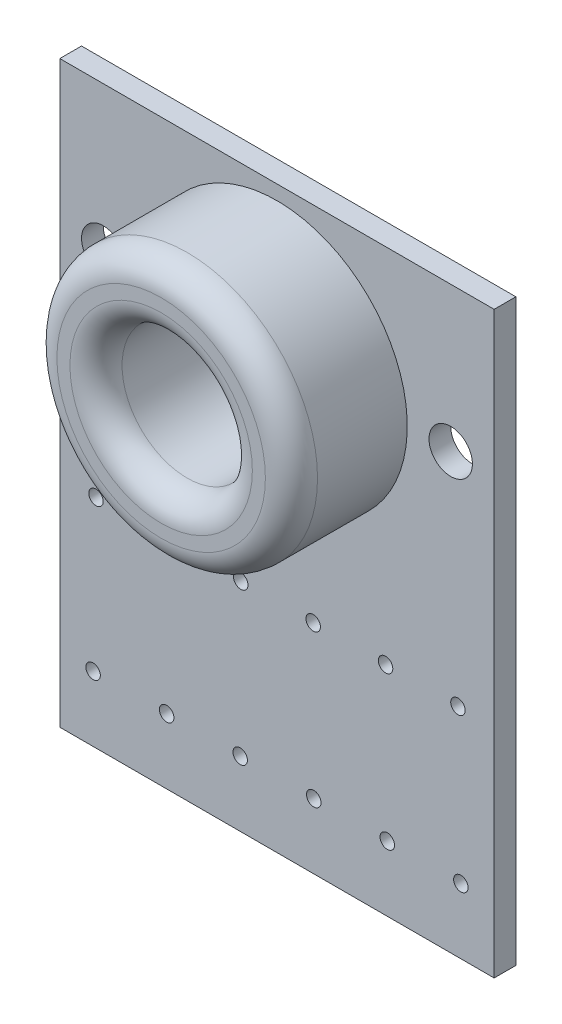
ISO-10303-21;
HEADER;
FILE_DESCRIPTION(('STEP AP214'),'2;1');
FILE_NAME('part.step','',(''),(''),'','','');
FILE_SCHEMA(('AUTOMOTIVE_DESIGN { 1 0 10303 214 1 1 1 1 }'));
ENDSEC;
DATA;
#1=APPLICATION_CONTEXT('core data for automotive mechanical design processes');
#2=APPLICATION_PROTOCOL_DEFINITION('international standard','automotive_design',2000,#1);
#3=PRODUCT_CONTEXT('',#1,'mechanical');
#4=PRODUCT('Part','Part','',(#3));
#5=PRODUCT_RELATED_PRODUCT_CATEGORY('part','',(#4));
#6=PRODUCT_DEFINITION_FORMATION('','',#4);
#7=PRODUCT_DEFINITION_CONTEXT('part definition',#1,'design');
#8=PRODUCT_DEFINITION('design','',#6,#7);
#9=PRODUCT_DEFINITION_SHAPE('','',#8);
#10=(LENGTH_UNIT() NAMED_UNIT(*) SI_UNIT(.MILLI.,.METRE.));
#11=(NAMED_UNIT(*) PLANE_ANGLE_UNIT() SI_UNIT($,.RADIAN.));
#12=(NAMED_UNIT(*) SI_UNIT($,.STERADIAN.) SOLID_ANGLE_UNIT());
#13=UNCERTAINTY_MEASURE_WITH_UNIT(LENGTH_MEASURE(1.E-05),#10,'distance_accuracy_value','');
#14=(GEOMETRIC_REPRESENTATION_CONTEXT(3) GLOBAL_UNCERTAINTY_ASSIGNED_CONTEXT((#13)) GLOBAL_UNIT_ASSIGNED_CONTEXT((#10,
#11,#12)) REPRESENTATION_CONTEXT('',''));
#15=CARTESIAN_POINT('',(0.,0.,0.));
#16=DIRECTION('',(0.,0.,1.));
#17=DIRECTION('',(1.,0.,0.));
#18=AXIS2_PLACEMENT_3D('',#15,#16,#17);
#19=CARTESIAN_POINT('',(-15.,20.,1.5));
#20=DIRECTION('',(0.,0.,-1.));
#21=DIRECTION('',(-1.,0.,0.));
#22=AXIS2_PLACEMENT_3D('',#19,#20,#21);
#23=PLANE('',#22);
#24=CARTESIAN_POINT('',(-12.,10.,1.5));
#25=DIRECTION('',(0.,0.,1.));
#26=DIRECTION('',(1.,0.,0.));
#27=AXIS2_PLACEMENT_3D('',#24,#25,#26);
#28=CIRCLE('',#27,1.5);
#29=CARTESIAN_POINT('',(-10.5,10.,1.5));
#30=VERTEX_POINT('',#29);
#31=EDGE_CURVE('E146',#30,#30,#28,.T.);
#32=ORIENTED_EDGE('',*,*,#31,.F.);
#33=EDGE_LOOP('',(#32));
#34=FACE_BOUND('',#33,.T.);
#35=CARTESIAN_POINT('',(7.5,-5.,1.5));
#36=DIRECTION('',(0.,0.,1.));
#37=DIRECTION('',(1.,0.,0.));
#38=AXIS2_PLACEMENT_3D('',#35,#36,#37);
#39=CIRCLE('',#38,0.500000000000001);
#40=CARTESIAN_POINT('',(8.,-5.,1.5));
#41=VERTEX_POINT('',#40);
#42=EDGE_CURVE('E158',#41,#41,#39,.T.);
#43=ORIENTED_EDGE('',*,*,#42,.F.);
#44=EDGE_LOOP('',(#43));
#45=FACE_BOUND('',#44,.T.);
#46=CARTESIAN_POINT('',(-2.5,-5.,1.5));
#47=DIRECTION('',(0.,0.,1.));
#48=DIRECTION('',(1.,0.,0.));
#49=AXIS2_PLACEMENT_3D('',#46,#47,#48);
#50=CIRCLE('',#49,0.500000000000001);
#51=CARTESIAN_POINT('',(-2.,-5.,1.5));
#52=VERTEX_POINT('',#51);
#53=EDGE_CURVE('E170',#52,#52,#50,.T.);
#54=ORIENTED_EDGE('',*,*,#53,.F.);
#55=EDGE_LOOP('',(#54));
#56=FACE_BOUND('',#55,.T.);
#57=CARTESIAN_POINT('',(12.7,-15.5,1.5));
#58=DIRECTION('',(0.,0.,1.));
#59=DIRECTION('',(1.,0.,0.));
#60=AXIS2_PLACEMENT_3D('',#57,#58,#59);
#61=CIRCLE('',#60,0.500000000000001);
#62=CARTESIAN_POINT('',(13.2,-15.5,1.5));
#63=VERTEX_POINT('',#62);
#64=EDGE_CURVE('E182',#63,#63,#61,.T.);
#65=ORIENTED_EDGE('',*,*,#64,.F.);
#66=EDGE_LOOP('',(#65));
#67=FACE_BOUND('',#66,.T.);
#68=CARTESIAN_POINT('',(2.54,-15.5,1.5));
#69=DIRECTION('',(0.,0.,1.));
#70=DIRECTION('',(1.,0.,0.));
#71=AXIS2_PLACEMENT_3D('',#68,#69,#70);
#72=CIRCLE('',#71,0.500000000000001);
#73=CARTESIAN_POINT('',(3.04,-15.5,1.5));
#74=VERTEX_POINT('',#73);
#75=EDGE_CURVE('E194',#74,#74,#72,.T.);
#76=ORIENTED_EDGE('',*,*,#75,.F.);
#77=EDGE_LOOP('',(#76));
#78=FACE_BOUND('',#77,.T.);
#79=CARTESIAN_POINT('',(-7.62,-15.5,1.5));
#80=DIRECTION('',(0.,0.,1.));
#81=DIRECTION('',(1.,0.,0.));
#82=AXIS2_PLACEMENT_3D('',#79,#80,#81);
#83=CIRCLE('',#82,0.500000000000001);
#84=CARTESIAN_POINT('',(-7.12,-15.5,1.5));
#85=VERTEX_POINT('',#84);
#86=EDGE_CURVE('E206',#85,#85,#83,.T.);
#87=ORIENTED_EDGE('',*,*,#86,.F.);
#88=EDGE_LOOP('',(#87));
#89=FACE_BOUND('',#88,.T.);
#90=CARTESIAN_POINT('',(-12.5,-5.,1.5));
#91=DIRECTION('',(0.,0.,1.));
#92=DIRECTION('',(1.,0.,0.));
#93=AXIS2_PLACEMENT_3D('',#90,#91,#92);
#94=CIRCLE('',#93,0.500000000000001);
#95=CARTESIAN_POINT('',(-12.,-5.,1.5));
#96=VERTEX_POINT('',#95);
#97=EDGE_CURVE('E218',#96,#96,#94,.T.);
#98=ORIENTED_EDGE('',*,*,#97,.F.);
#99=EDGE_LOOP('',(#98));
#100=FACE_BOUND('',#99,.T.);
#101=DIRECTION('',(0.,-1.,0.));
#102=VECTOR('',#101,1.);
#103=CARTESIAN_POINT('',(-15.,-20.,1.5));
#104=LINE('',#103,#102);
#105=CARTESIAN_POINT('',(-15.,20.,1.5));
#106=VERTEX_POINT('',#105);
#107=CARTESIAN_POINT('',(-15.,-20.,1.5));
#108=VERTEX_POINT('',#107);
#109=EDGE_CURVE('E84',#106,#108,#104,.T.);
#110=ORIENTED_EDGE('',*,*,#109,.T.);
#111=DIRECTION('',(1.,0.,0.));
#112=VECTOR('',#111,1.);
#113=CARTESIAN_POINT('',(-15.,-20.,1.5));
#114=LINE('',#113,#112);
#115=CARTESIAN_POINT('',(15.,-20.,1.5));
#116=VERTEX_POINT('',#115);
#117=EDGE_CURVE('E79',#108,#116,#114,.T.);
#118=ORIENTED_EDGE('',*,*,#117,.T.);
#119=DIRECTION('',(0.,1.,0.));
#120=VECTOR('',#119,1.);
#121=CARTESIAN_POINT('',(15.,-20.,1.5));
#122=LINE('',#121,#120);
#123=CARTESIAN_POINT('',(15.,20.,1.5));
#124=VERTEX_POINT('',#123);
#125=EDGE_CURVE('E82',#116,#124,#122,.T.);
#126=ORIENTED_EDGE('',*,*,#125,.T.);
#127=DIRECTION('',(-1.,0.,0.));
#128=VECTOR('',#127,1.);
#129=CARTESIAN_POINT('',(-15.,20.,1.5));
#130=LINE('',#129,#128);
#131=EDGE_CURVE('E48',#124,#106,#130,.T.);
#132=ORIENTED_EDGE('',*,*,#131,.T.);
#133=EDGE_LOOP('',(#110,#118,#126,#132));
#134=FACE_BOUND('',#133,.T.);
#135=CARTESIAN_POINT('',(-12.7,-15.5,1.5));
#136=DIRECTION('',(0.,0.,1.));
#137=DIRECTION('',(1.,0.,0.));
#138=AXIS2_PLACEMENT_3D('',#135,#136,#137);
#139=CIRCLE('',#138,0.500000000000001);
#140=CARTESIAN_POINT('',(-12.2,-15.5,1.5));
#141=VERTEX_POINT('',#140);
#142=EDGE_CURVE('E102',#141,#141,#139,.T.);
#143=ORIENTED_EDGE('',*,*,#142,.F.);
#144=EDGE_LOOP('',(#143));
#145=FACE_BOUND('',#144,.T.);
#146=CARTESIAN_POINT('',(-2.54,-15.5,1.5));
#147=DIRECTION('',(0.,0.,1.));
#148=DIRECTION('',(1.,0.,0.));
#149=AXIS2_PLACEMENT_3D('',#146,#147,#148);
#150=CIRCLE('',#149,0.500000000000001);
#151=CARTESIAN_POINT('',(-2.04,-15.5,1.5));
#152=VERTEX_POINT('',#151);
#153=EDGE_CURVE('E200',#152,#152,#150,.T.);
#154=ORIENTED_EDGE('',*,*,#153,.F.);
#155=EDGE_LOOP('',(#154));
#156=FACE_BOUND('',#155,.T.);
#157=CARTESIAN_POINT('',(7.62,-15.5,1.5));
#158=DIRECTION('',(0.,0.,1.));
#159=DIRECTION('',(1.,0.,0.));
#160=AXIS2_PLACEMENT_3D('',#157,#158,#159);
#161=CIRCLE('',#160,0.500000000000001);
#162=CARTESIAN_POINT('',(8.12,-15.5,1.5));
#163=VERTEX_POINT('',#162);
#164=EDGE_CURVE('E188',#163,#163,#161,.T.);
#165=ORIENTED_EDGE('',*,*,#164,.F.);
#166=EDGE_LOOP('',(#165));
#167=FACE_BOUND('',#166,.T.);
#168=CARTESIAN_POINT('',(-7.5,-5.,1.5));
#169=DIRECTION('',(0.,0.,1.));
#170=DIRECTION('',(1.,0.,0.));
#171=AXIS2_PLACEMENT_3D('',#168,#169,#170);
#172=CIRCLE('',#171,0.500000000000001);
#173=CARTESIAN_POINT('',(-7.,-5.,1.5));
#174=VERTEX_POINT('',#173);
#175=EDGE_CURVE('E176',#174,#174,#172,.T.);
#176=ORIENTED_EDGE('',*,*,#175,.F.);
#177=EDGE_LOOP('',(#176));
#178=FACE_BOUND('',#177,.T.);
#179=CARTESIAN_POINT('',(2.5,-5.,1.5));
#180=DIRECTION('',(0.,0.,1.));
#181=DIRECTION('',(1.,0.,0.));
#182=AXIS2_PLACEMENT_3D('',#179,#180,#181);
#183=CIRCLE('',#182,0.500000000000001);
#184=CARTESIAN_POINT('',(3.,-5.,1.5));
#185=VERTEX_POINT('',#184);
#186=EDGE_CURVE('E164',#185,#185,#183,.T.);
#187=ORIENTED_EDGE('',*,*,#186,.F.);
#188=EDGE_LOOP('',(#187));
#189=FACE_BOUND('',#188,.T.);
#190=CARTESIAN_POINT('',(12.5,-5.,1.5));
#191=DIRECTION('',(0.,0.,1.));
#192=DIRECTION('',(1.,0.,0.));
#193=AXIS2_PLACEMENT_3D('',#190,#191,#192);
#194=CIRCLE('',#193,0.500000000000001);
#195=CARTESIAN_POINT('',(13.,-5.,1.5));
#196=VERTEX_POINT('',#195);
#197=EDGE_CURVE('E152',#196,#196,#194,.T.);
#198=ORIENTED_EDGE('',*,*,#197,.F.);
#199=EDGE_LOOP('',(#198));
#200=FACE_BOUND('',#199,.T.);
#201=CARTESIAN_POINT('',(12.,10.,1.5));
#202=DIRECTION('',(0.,0.,1.));
#203=DIRECTION('',(-1.,0.,0.));
#204=AXIS2_PLACEMENT_3D('',#201,#202,#203);
#205=CIRCLE('',#204,1.5);
#206=CARTESIAN_POINT('',(10.5,10.,1.5));
#207=VERTEX_POINT('',#206);
#208=EDGE_CURVE('E140',#207,#207,#205,.T.);
#209=ORIENTED_EDGE('',*,*,#208,.F.);
#210=EDGE_LOOP('',(#209));
#211=FACE_BOUND('',#210,.T.);
#212=CARTESIAN_POINT('',(0.,10.,1.5));
#213=DIRECTION('',(0.,0.,-1.));
#214=DIRECTION('',(-1.,0.,0.));
#215=AXIS2_PLACEMENT_3D('',#212,#213,#214);
#216=CIRCLE('',#215,9.);
#217=CARTESIAN_POINT('',(-9.,10.,1.5));
#218=VERTEX_POINT('',#217);
#219=EDGE_CURVE('E109',#218,#218,#216,.F.);
#220=ORIENTED_EDGE('',*,*,#219,.F.);
#221=EDGE_LOOP('',(#220));
#222=FACE_BOUND('',#221,.T.);
#223=ADVANCED_FACE('F31',(#34,#45,#56,#67,#78,#89,#100,#134,#145,#156,#167,#178,#189,#200,#211,
#222),#23,.F.);
#224=CARTESIAN_POINT('',(0.,10.,1.5));
#225=DIRECTION('',(0.,0.,1.));
#226=DIRECTION('',(1.,0.,0.));
#227=AXIS2_PLACEMENT_3D('',#224,#225,#226);
#228=CIRCLE('',#227,4.5);
#229=CARTESIAN_POINT('',(4.5,10.,1.5));
#230=VERTEX_POINT('',#229);
#231=EDGE_CURVE('E135',#230,#230,#228,.T.);
#232=ORIENTED_EDGE('',*,*,#231,.T.);
#233=EDGE_LOOP('',(#232));
#234=FACE_BOUND('',#233,.T.);
#235=CARTESIAN_POINT('',(0.,10.,1.5));
#236=DIRECTION('',(0.,0.,1.));
#237=DIRECTION('',(1.,0.,0.));
#238=AXIS2_PLACEMENT_3D('',#235,#236,#237);
#239=CIRCLE('',#238,2.);
#240=CARTESIAN_POINT('',(2.,10.,1.5));
#241=VERTEX_POINT('',#240);
#242=EDGE_CURVE('E212',#241,#241,#239,.T.);
#243=ORIENTED_EDGE('',*,*,#242,.F.);
#244=EDGE_LOOP('',(#243));
#245=FACE_BOUND('',#244,.T.);
#246=ADVANCED_FACE('F248',(#234,#245),#23,.F.);
#247=CARTESIAN_POINT('',(-15.,20.,0.));
#248=DIRECTION('',(0.,0.,-1.));
#249=DIRECTION('',(-1.,0.,0.));
#250=AXIS2_PLACEMENT_3D('',#247,#248,#249);
#251=PLANE('',#250);
#252=CARTESIAN_POINT('',(-12.,10.,0.));
#253=DIRECTION('',(0.,0.,1.));
#254=DIRECTION('',(1.,0.,0.));
#255=AXIS2_PLACEMENT_3D('',#252,#253,#254);
#256=CIRCLE('',#255,1.5);
#257=CARTESIAN_POINT('',(-10.5,10.,0.));
#258=VERTEX_POINT('',#257);
#259=EDGE_CURVE('E144',#258,#258,#256,.T.);
#260=ORIENTED_EDGE('',*,*,#259,.T.);
#261=EDGE_LOOP('',(#260));
#262=FACE_BOUND('',#261,.T.);
#263=CARTESIAN_POINT('',(7.5,-5.,0.));
#264=DIRECTION('',(0.,0.,1.));
#265=DIRECTION('',(1.,0.,0.));
#266=AXIS2_PLACEMENT_3D('',#263,#264,#265);
#267=CIRCLE('',#266,0.500000000000001);
#268=CARTESIAN_POINT('',(8.,-5.,0.));
#269=VERTEX_POINT('',#268);
#270=EDGE_CURVE('E155',#269,#269,#267,.T.);
#271=ORIENTED_EDGE('',*,*,#270,.T.);
#272=EDGE_LOOP('',(#271));
#273=FACE_BOUND('',#272,.T.);
#274=CARTESIAN_POINT('',(-2.5,-5.,0.));
#275=DIRECTION('',(0.,0.,1.));
#276=DIRECTION('',(1.,0.,0.));
#277=AXIS2_PLACEMENT_3D('',#274,#275,#276);
#278=CIRCLE('',#277,0.500000000000001);
#279=CARTESIAN_POINT('',(-2.,-5.,0.));
#280=VERTEX_POINT('',#279);
#281=EDGE_CURVE('E167',#280,#280,#278,.T.);
#282=ORIENTED_EDGE('',*,*,#281,.T.);
#283=EDGE_LOOP('',(#282));
#284=FACE_BOUND('',#283,.T.);
#285=CARTESIAN_POINT('',(12.7,-15.5,0.));
#286=DIRECTION('',(0.,0.,1.));
#287=DIRECTION('',(1.,0.,0.));
#288=AXIS2_PLACEMENT_3D('',#285,#286,#287);
#289=CIRCLE('',#288,0.500000000000001);
#290=CARTESIAN_POINT('',(13.2,-15.5,0.));
#291=VERTEX_POINT('',#290);
#292=EDGE_CURVE('E179',#291,#291,#289,.T.);
#293=ORIENTED_EDGE('',*,*,#292,.T.);
#294=EDGE_LOOP('',(#293));
#295=FACE_BOUND('',#294,.T.);
#296=CARTESIAN_POINT('',(2.54,-15.5,0.));
#297=DIRECTION('',(0.,0.,1.));
#298=DIRECTION('',(1.,0.,0.));
#299=AXIS2_PLACEMENT_3D('',#296,#297,#298);
#300=CIRCLE('',#299,0.500000000000001);
#301=CARTESIAN_POINT('',(3.04,-15.5,0.));
#302=VERTEX_POINT('',#301);
#303=EDGE_CURVE('E191',#302,#302,#300,.T.);
#304=ORIENTED_EDGE('',*,*,#303,.T.);
#305=EDGE_LOOP('',(#304));
#306=FACE_BOUND('',#305,.T.);
#307=CARTESIAN_POINT('',(-7.62,-15.5,0.));
#308=DIRECTION('',(0.,0.,1.));
#309=DIRECTION('',(1.,0.,0.));
#310=AXIS2_PLACEMENT_3D('',#307,#308,#309);
#311=CIRCLE('',#310,0.500000000000001);
#312=CARTESIAN_POINT('',(-7.12,-15.5,0.));
#313=VERTEX_POINT('',#312);
#314=EDGE_CURVE('E203',#313,#313,#311,.T.);
#315=ORIENTED_EDGE('',*,*,#314,.T.);
#316=EDGE_LOOP('',(#315));
#317=FACE_BOUND('',#316,.T.);
#318=CARTESIAN_POINT('',(-12.5,-5.,0.));
#319=DIRECTION('',(0.,0.,1.));
#320=DIRECTION('',(1.,0.,0.));
#321=AXIS2_PLACEMENT_3D('',#318,#319,#320);
#322=CIRCLE('',#321,0.500000000000001);
#323=CARTESIAN_POINT('',(-12.,-5.,0.));
#324=VERTEX_POINT('',#323);
#325=EDGE_CURVE('E215',#324,#324,#322,.T.);
#326=ORIENTED_EDGE('',*,*,#325,.T.);
#327=EDGE_LOOP('',(#326));
#328=FACE_BOUND('',#327,.T.);
#329=DIRECTION('',(0.,-1.,0.));
#330=VECTOR('',#329,1.);
#331=CARTESIAN_POINT('',(-15.,-20.,0.));
#332=LINE('',#331,#330);
#333=CARTESIAN_POINT('',(-15.,20.,0.));
#334=VERTEX_POINT('',#333);
#335=CARTESIAN_POINT('',(-15.,-20.,0.));
#336=VERTEX_POINT('',#335);
#337=EDGE_CURVE('E99',#334,#336,#332,.T.);
#338=ORIENTED_EDGE('',*,*,#337,.F.);
#339=DIRECTION('',(-1.,0.,0.));
#340=VECTOR('',#339,1.);
#341=CARTESIAN_POINT('',(-15.,20.,0.));
#342=LINE('',#341,#340);
#343=CARTESIAN_POINT('',(15.,20.,0.));
#344=VERTEX_POINT('',#343);
#345=EDGE_CURVE('E71',#344,#334,#342,.T.);
#346=ORIENTED_EDGE('',*,*,#345,.F.);
#347=DIRECTION('',(0.,1.,0.));
#348=VECTOR('',#347,1.);
#349=CARTESIAN_POINT('',(15.,-20.,0.));
#350=LINE('',#349,#348);
#351=CARTESIAN_POINT('',(15.,-20.,0.));
#352=VERTEX_POINT('',#351);
#353=EDGE_CURVE('E65',#352,#344,#350,.T.);
#354=ORIENTED_EDGE('',*,*,#353,.F.);
#355=DIRECTION('',(1.,0.,0.));
#356=VECTOR('',#355,1.);
#357=CARTESIAN_POINT('',(-15.,-20.,0.));
#358=LINE('',#357,#356);
#359=EDGE_CURVE('E89',#336,#352,#358,.T.);
#360=ORIENTED_EDGE('',*,*,#359,.F.);
#361=EDGE_LOOP('',(#338,#346,#354,#360));
#362=FACE_BOUND('',#361,.T.);
#363=CARTESIAN_POINT('',(-12.7,-15.5,0.));
#364=DIRECTION('',(0.,0.,1.));
#365=DIRECTION('',(1.,0.,0.));
#366=AXIS2_PLACEMENT_3D('',#363,#364,#365);
#367=CIRCLE('',#366,0.500000000000001);
#368=CARTESIAN_POINT('',(-12.2,-15.5,0.));
#369=VERTEX_POINT('',#368);
#370=EDGE_CURVE('E221',#369,#369,#367,.T.);
#371=ORIENTED_EDGE('',*,*,#370,.T.);
#372=EDGE_LOOP('',(#371));
#373=FACE_BOUND('',#372,.T.);
#374=CARTESIAN_POINT('',(0.,10.,0.));
#375=DIRECTION('',(0.,0.,1.));
#376=DIRECTION('',(1.,0.,0.));
#377=AXIS2_PLACEMENT_3D('',#374,#375,#376);
#378=CIRCLE('',#377,2.);
#379=CARTESIAN_POINT('',(2.,10.,0.));
#380=VERTEX_POINT('',#379);
#381=EDGE_CURVE('E209',#380,#380,#378,.T.);
#382=ORIENTED_EDGE('',*,*,#381,.T.);
#383=EDGE_LOOP('',(#382));
#384=FACE_BOUND('',#383,.T.);
#385=CARTESIAN_POINT('',(-2.54,-15.5,0.));
#386=DIRECTION('',(0.,0.,1.));
#387=DIRECTION('',(1.,0.,0.));
#388=AXIS2_PLACEMENT_3D('',#385,#386,#387);
#389=CIRCLE('',#388,0.500000000000001);
#390=CARTESIAN_POINT('',(-2.04,-15.5,0.));
#391=VERTEX_POINT('',#390);
#392=EDGE_CURVE('E197',#391,#391,#389,.T.);
#393=ORIENTED_EDGE('',*,*,#392,.T.);
#394=EDGE_LOOP('',(#393));
#395=FACE_BOUND('',#394,.T.);
#396=CARTESIAN_POINT('',(7.62,-15.5,0.));
#397=DIRECTION('',(0.,0.,1.));
#398=DIRECTION('',(1.,0.,0.));
#399=AXIS2_PLACEMENT_3D('',#396,#397,#398);
#400=CIRCLE('',#399,0.500000000000001);
#401=CARTESIAN_POINT('',(8.12,-15.5,0.));
#402=VERTEX_POINT('',#401);
#403=EDGE_CURVE('E185',#402,#402,#400,.T.);
#404=ORIENTED_EDGE('',*,*,#403,.T.);
#405=EDGE_LOOP('',(#404));
#406=FACE_BOUND('',#405,.T.);
#407=CARTESIAN_POINT('',(-7.5,-5.,0.));
#408=DIRECTION('',(0.,0.,1.));
#409=DIRECTION('',(1.,0.,0.));
#410=AXIS2_PLACEMENT_3D('',#407,#408,#409);
#411=CIRCLE('',#410,0.500000000000001);
#412=CARTESIAN_POINT('',(-7.,-5.,0.));
#413=VERTEX_POINT('',#412);
#414=EDGE_CURVE('E173',#413,#413,#411,.T.);
#415=ORIENTED_EDGE('',*,*,#414,.T.);
#416=EDGE_LOOP('',(#415));
#417=FACE_BOUND('',#416,.T.);
#418=CARTESIAN_POINT('',(2.5,-5.,0.));
#419=DIRECTION('',(0.,0.,1.));
#420=DIRECTION('',(1.,0.,0.));
#421=AXIS2_PLACEMENT_3D('',#418,#419,#420);
#422=CIRCLE('',#421,0.500000000000001);
#423=CARTESIAN_POINT('',(3.,-5.,0.));
#424=VERTEX_POINT('',#423);
#425=EDGE_CURVE('E161',#424,#424,#422,.T.);
#426=ORIENTED_EDGE('',*,*,#425,.T.);
#427=EDGE_LOOP('',(#426));
#428=FACE_BOUND('',#427,.T.);
#429=CARTESIAN_POINT('',(12.5,-5.,0.));
#430=DIRECTION('',(0.,0.,1.));
#431=DIRECTION('',(1.,0.,0.));
#432=AXIS2_PLACEMENT_3D('',#429,#430,#431);
#433=CIRCLE('',#432,0.500000000000001);
#434=CARTESIAN_POINT('',(13.,-5.,0.));
#435=VERTEX_POINT('',#434);
#436=EDGE_CURVE('E149',#435,#435,#433,.T.);
#437=ORIENTED_EDGE('',*,*,#436,.T.);
#438=EDGE_LOOP('',(#437));
#439=FACE_BOUND('',#438,.T.);
#440=CARTESIAN_POINT('',(12.,10.,0.));
#441=DIRECTION('',(0.,0.,1.));
#442=DIRECTION('',(-1.,0.,0.));
#443=AXIS2_PLACEMENT_3D('',#440,#441,#442);
#444=CIRCLE('',#443,1.5);
#445=CARTESIAN_POINT('',(10.5,10.,0.));
#446=VERTEX_POINT('',#445);
#447=EDGE_CURVE('E137',#446,#446,#444,.T.);
#448=ORIENTED_EDGE('',*,*,#447,.T.);
#449=EDGE_LOOP('',(#448));
#450=FACE_BOUND('',#449,.T.);
#451=ADVANCED_FACE('F229',(#262,#273,#284,#295,#306,#317,#328,#362,#373,#384,#395,#406,#417,
#428,#439,#450),#251,.T.);
#452=CARTESIAN_POINT('',(-15.,-20.,1.5));
#453=DIRECTION('',(1.,0.,0.));
#454=DIRECTION('',(0.,1.,0.));
#455=AXIS2_PLACEMENT_3D('',#452,#453,#454);
#456=PLANE('',#455);
#457=ORIENTED_EDGE('',*,*,#337,.T.);
#458=DIRECTION('',(0.,0.,-1.));
#459=VECTOR('',#458,1.);
#460=CARTESIAN_POINT('',(-15.,-20.,1.5));
#461=LINE('',#460,#459);
#462=EDGE_CURVE('E90',#108,#336,#461,.T.);
#463=ORIENTED_EDGE('',*,*,#462,.F.);
#464=ORIENTED_EDGE('',*,*,#109,.F.);
#465=DIRECTION('',(0.,0.,-1.));
#466=VECTOR('',#465,1.);
#467=CARTESIAN_POINT('',(-15.,20.,1.5));
#468=LINE('',#467,#466);
#469=EDGE_CURVE('E95',#106,#334,#468,.T.);
#470=ORIENTED_EDGE('',*,*,#469,.T.);
#471=EDGE_LOOP('',(#457,#463,#464,#470));
#472=FACE_BOUND('',#471,.T.);
#473=ADVANCED_FACE('F257',(#472),#456,.F.);
#474=CARTESIAN_POINT('',(-15.,-20.,1.5));
#475=DIRECTION('',(0.,1.,0.));
#476=DIRECTION('',(0.,0.,1.));
#477=AXIS2_PLACEMENT_3D('',#474,#475,#476);
#478=PLANE('',#477);
#479=ORIENTED_EDGE('',*,*,#359,.T.);
#480=DIRECTION('',(0.,0.,-1.));
#481=VECTOR('',#480,1.);
#482=CARTESIAN_POINT('',(15.,-20.,1.5));
#483=LINE('',#482,#481);
#484=EDGE_CURVE('E87',#116,#352,#483,.T.);
#485=ORIENTED_EDGE('',*,*,#484,.F.);
#486=ORIENTED_EDGE('',*,*,#117,.F.);
#487=ORIENTED_EDGE('',*,*,#462,.T.);
#488=EDGE_LOOP('',(#479,#485,#486,#487));
#489=FACE_BOUND('',#488,.T.);
#490=ADVANCED_FACE('F88',(#489),#478,.F.);
#491=CARTESIAN_POINT('',(15.,-20.,1.5));
#492=DIRECTION('',(-1.,0.,0.));
#493=DIRECTION('',(0.,-1.,0.));
#494=AXIS2_PLACEMENT_3D('',#491,#492,#493);
#495=PLANE('',#494);
#496=ORIENTED_EDGE('',*,*,#353,.T.);
#497=DIRECTION('',(0.,0.,-1.));
#498=VECTOR('',#497,1.);
#499=CARTESIAN_POINT('',(15.,20.,1.5));
#500=LINE('',#499,#498);
#501=EDGE_CURVE('E91',#124,#344,#500,.T.);
#502=ORIENTED_EDGE('',*,*,#501,.F.);
#503=ORIENTED_EDGE('',*,*,#125,.F.);
#504=ORIENTED_EDGE('',*,*,#484,.T.);
#505=EDGE_LOOP('',(#496,#502,#503,#504));
#506=FACE_BOUND('',#505,.T.);
#507=ADVANCED_FACE('F93',(#506),#495,.F.);
#508=CARTESIAN_POINT('',(-15.,20.,1.5));
#509=DIRECTION('',(0.,-1.,0.));
#510=DIRECTION('',(0.,0.,-1.));
#511=AXIS2_PLACEMENT_3D('',#508,#509,#510);
#512=PLANE('',#511);
#513=ORIENTED_EDGE('',*,*,#345,.T.);
#514=ORIENTED_EDGE('',*,*,#469,.F.);
#515=ORIENTED_EDGE('',*,*,#131,.F.);
#516=ORIENTED_EDGE('',*,*,#501,.T.);
#517=EDGE_LOOP('',(#513,#514,#515,#516));
#518=FACE_BOUND('',#517,.T.);
#519=ADVANCED_FACE('F235',(#518),#512,.F.);
#520=CARTESIAN_POINT('',(-12.7,-15.5,1.5));
#521=DIRECTION('',(0.,0.,-1.));
#522=DIRECTION('',(-1.,0.,0.));
#523=AXIS2_PLACEMENT_3D('',#520,#521,#522);
#524=CYLINDRICAL_SURFACE('',#523,0.500000000000001);
#525=ORIENTED_EDGE('',*,*,#142,.T.);
#526=EDGE_LOOP('',(#525));
#527=FACE_BOUND('',#526,.T.);
#528=ORIENTED_EDGE('',*,*,#370,.F.);
#529=EDGE_LOOP('',(#528));
#530=FACE_BOUND('',#529,.T.);
#531=ADVANCED_FACE('F232',(#527,#530),#524,.F.);
#532=CARTESIAN_POINT('',(-12.5,-5.,1.5));
#533=DIRECTION('',(0.,0.,-1.));
#534=DIRECTION('',(-1.,0.,0.));
#535=AXIS2_PLACEMENT_3D('',#532,#533,#534);
#536=CYLINDRICAL_SURFACE('',#535,0.500000000000001);
#537=ORIENTED_EDGE('',*,*,#97,.T.);
#538=EDGE_LOOP('',(#537));
#539=FACE_BOUND('',#538,.T.);
#540=ORIENTED_EDGE('',*,*,#325,.F.);
#541=EDGE_LOOP('',(#540));
#542=FACE_BOUND('',#541,.T.);
#543=ADVANCED_FACE('F234',(#539,#542),#536,.F.);
#544=CARTESIAN_POINT('',(0.,10.,1.5));
#545=DIRECTION('',(0.,0.,-1.));
#546=DIRECTION('',(-1.,0.,0.));
#547=AXIS2_PLACEMENT_3D('',#544,#545,#546);
#548=CYLINDRICAL_SURFACE('',#547,2.);
#549=ORIENTED_EDGE('',*,*,#242,.T.);
#550=EDGE_LOOP('',(#549));
#551=FACE_BOUND('',#550,.T.);
#552=ORIENTED_EDGE('',*,*,#381,.F.);
#553=EDGE_LOOP('',(#552));
#554=FACE_BOUND('',#553,.T.);
#555=ADVANCED_FACE('F242',(#551,#554),#548,.F.);
#556=CARTESIAN_POINT('',(-7.62,-15.5,1.5));
#557=DIRECTION('',(0.,0.,-1.));
#558=DIRECTION('',(-1.,0.,0.));
#559=AXIS2_PLACEMENT_3D('',#556,#557,#558);
#560=CYLINDRICAL_SURFACE('',#559,0.500000000000001);
#561=ORIENTED_EDGE('',*,*,#86,.T.);
#562=EDGE_LOOP('',(#561));
#563=FACE_BOUND('',#562,.T.);
#564=ORIENTED_EDGE('',*,*,#314,.F.);
#565=EDGE_LOOP('',(#564));
#566=FACE_BOUND('',#565,.T.);
#567=ADVANCED_FACE('F303',(#563,#566),#560,.F.);
#568=CARTESIAN_POINT('',(-2.54,-15.5,1.5));
#569=DIRECTION('',(0.,0.,-1.));
#570=DIRECTION('',(-1.,0.,0.));
#571=AXIS2_PLACEMENT_3D('',#568,#569,#570);
#572=CYLINDRICAL_SURFACE('',#571,0.500000000000001);
#573=ORIENTED_EDGE('',*,*,#153,.T.);
#574=EDGE_LOOP('',(#573));
#575=FACE_BOUND('',#574,.T.);
#576=ORIENTED_EDGE('',*,*,#392,.F.);
#577=EDGE_LOOP('',(#576));
#578=FACE_BOUND('',#577,.T.);
#579=ADVANCED_FACE('F313',(#575,#578),#572,.F.);
#580=CARTESIAN_POINT('',(2.54,-15.5,1.5));
#581=DIRECTION('',(0.,0.,-1.));
#582=DIRECTION('',(-1.,0.,0.));
#583=AXIS2_PLACEMENT_3D('',#580,#581,#582);
#584=CYLINDRICAL_SURFACE('',#583,0.500000000000001);
#585=ORIENTED_EDGE('',*,*,#75,.T.);
#586=EDGE_LOOP('',(#585));
#587=FACE_BOUND('',#586,.T.);
#588=ORIENTED_EDGE('',*,*,#303,.F.);
#589=EDGE_LOOP('',(#588));
#590=FACE_BOUND('',#589,.T.);
#591=ADVANCED_FACE('F323',(#587,#590),#584,.F.);
#592=CARTESIAN_POINT('',(7.62,-15.5,1.5));
#593=DIRECTION('',(0.,0.,-1.));
#594=DIRECTION('',(-1.,0.,0.));
#595=AXIS2_PLACEMENT_3D('',#592,#593,#594);
#596=CYLINDRICAL_SURFACE('',#595,0.500000000000001);
#597=ORIENTED_EDGE('',*,*,#164,.T.);
#598=EDGE_LOOP('',(#597));
#599=FACE_BOUND('',#598,.T.);
#600=ORIENTED_EDGE('',*,*,#403,.F.);
#601=EDGE_LOOP('',(#600));
#602=FACE_BOUND('',#601,.T.);
#603=ADVANCED_FACE('F333',(#599,#602),#596,.F.);
#604=CARTESIAN_POINT('',(12.7,-15.5,1.5));
#605=DIRECTION('',(0.,0.,-1.));
#606=DIRECTION('',(-1.,0.,0.));
#607=AXIS2_PLACEMENT_3D('',#604,#605,#606);
#608=CYLINDRICAL_SURFACE('',#607,0.500000000000001);
#609=ORIENTED_EDGE('',*,*,#64,.T.);
#610=EDGE_LOOP('',(#609));
#611=FACE_BOUND('',#610,.T.);
#612=ORIENTED_EDGE('',*,*,#292,.F.);
#613=EDGE_LOOP('',(#612));
#614=FACE_BOUND('',#613,.T.);
#615=ADVANCED_FACE('F343',(#611,#614),#608,.F.);
#616=CARTESIAN_POINT('',(-7.5,-5.,1.5));
#617=DIRECTION('',(0.,0.,-1.));
#618=DIRECTION('',(-1.,0.,0.));
#619=AXIS2_PLACEMENT_3D('',#616,#617,#618);
#620=CYLINDRICAL_SURFACE('',#619,0.500000000000001);
#621=ORIENTED_EDGE('',*,*,#175,.T.);
#622=EDGE_LOOP('',(#621));
#623=FACE_BOUND('',#622,.T.);
#624=ORIENTED_EDGE('',*,*,#414,.F.);
#625=EDGE_LOOP('',(#624));
#626=FACE_BOUND('',#625,.T.);
#627=ADVANCED_FACE('F353',(#623,#626),#620,.F.);
#628=CARTESIAN_POINT('',(-2.5,-5.,1.5));
#629=DIRECTION('',(0.,0.,-1.));
#630=DIRECTION('',(-1.,0.,0.));
#631=AXIS2_PLACEMENT_3D('',#628,#629,#630);
#632=CYLINDRICAL_SURFACE('',#631,0.500000000000001);
#633=ORIENTED_EDGE('',*,*,#53,.T.);
#634=EDGE_LOOP('',(#633));
#635=FACE_BOUND('',#634,.T.);
#636=ORIENTED_EDGE('',*,*,#281,.F.);
#637=EDGE_LOOP('',(#636));
#638=FACE_BOUND('',#637,.T.);
#639=ADVANCED_FACE('F363',(#635,#638),#632,.F.);
#640=CARTESIAN_POINT('',(2.5,-5.,1.5));
#641=DIRECTION('',(0.,0.,-1.));
#642=DIRECTION('',(-1.,0.,0.));
#643=AXIS2_PLACEMENT_3D('',#640,#641,#642);
#644=CYLINDRICAL_SURFACE('',#643,0.500000000000001);
#645=ORIENTED_EDGE('',*,*,#186,.T.);
#646=EDGE_LOOP('',(#645));
#647=FACE_BOUND('',#646,.T.);
#648=ORIENTED_EDGE('',*,*,#425,.F.);
#649=EDGE_LOOP('',(#648));
#650=FACE_BOUND('',#649,.T.);
#651=ADVANCED_FACE('F373',(#647,#650),#644,.F.);
#652=CARTESIAN_POINT('',(7.5,-5.,1.5));
#653=DIRECTION('',(0.,0.,-1.));
#654=DIRECTION('',(-1.,0.,0.));
#655=AXIS2_PLACEMENT_3D('',#652,#653,#654);
#656=CYLINDRICAL_SURFACE('',#655,0.500000000000001);
#657=ORIENTED_EDGE('',*,*,#42,.T.);
#658=EDGE_LOOP('',(#657));
#659=FACE_BOUND('',#658,.T.);
#660=ORIENTED_EDGE('',*,*,#270,.F.);
#661=EDGE_LOOP('',(#660));
#662=FACE_BOUND('',#661,.T.);
#663=ADVANCED_FACE('F383',(#659,#662),#656,.F.);
#664=CARTESIAN_POINT('',(12.5,-5.,1.5));
#665=DIRECTION('',(0.,0.,-1.));
#666=DIRECTION('',(-1.,0.,0.));
#667=AXIS2_PLACEMENT_3D('',#664,#665,#666);
#668=CYLINDRICAL_SURFACE('',#667,0.500000000000001);
#669=ORIENTED_EDGE('',*,*,#197,.T.);
#670=EDGE_LOOP('',(#669));
#671=FACE_BOUND('',#670,.T.);
#672=ORIENTED_EDGE('',*,*,#436,.F.);
#673=EDGE_LOOP('',(#672));
#674=FACE_BOUND('',#673,.T.);
#675=ADVANCED_FACE('F393',(#671,#674),#668,.F.);
#676=CARTESIAN_POINT('',(-12.,10.,1.5));
#677=DIRECTION('',(0.,0.,-1.));
#678=DIRECTION('',(-1.,0.,0.));
#679=AXIS2_PLACEMENT_3D('',#676,#677,#678);
#680=CYLINDRICAL_SURFACE('',#679,1.5);
#681=ORIENTED_EDGE('',*,*,#31,.T.);
#682=EDGE_LOOP('',(#681));
#683=FACE_BOUND('',#682,.T.);
#684=ORIENTED_EDGE('',*,*,#259,.F.);
#685=EDGE_LOOP('',(#684));
#686=FACE_BOUND('',#685,.T.);
#687=ADVANCED_FACE('F403',(#683,#686),#680,.F.);
#688=CARTESIAN_POINT('',(12.,10.,1.5));
#689=DIRECTION('',(0.,0.,-1.));
#690=DIRECTION('',(-1.,0.,0.));
#691=AXIS2_PLACEMENT_3D('',#688,#689,#690);
#692=CYLINDRICAL_SURFACE('',#691,1.5);
#693=ORIENTED_EDGE('',*,*,#208,.T.);
#694=EDGE_LOOP('',(#693));
#695=FACE_BOUND('',#694,.T.);
#696=ORIENTED_EDGE('',*,*,#447,.F.);
#697=EDGE_LOOP('',(#696));
#698=FACE_BOUND('',#697,.T.);
#699=ADVANCED_FACE('F413',(#695,#698),#692,.F.);
#700=CARTESIAN_POINT('',(0.,10.,9.5));
#701=DIRECTION('',(0.,0.,1.));
#702=DIRECTION('',(1.,0.,0.));
#703=AXIS2_PLACEMENT_3D('',#700,#701,#702);
#704=PLANE('',#703);
#705=CARTESIAN_POINT('',(0.,10.,9.5));
#706=DIRECTION('',(0.,0.,1.));
#707=DIRECTION('',(1.,0.,0.));
#708=AXIS2_PLACEMENT_3D('',#705,#706,#707);
#709=CIRCLE('',#708,6.3);
#710=CARTESIAN_POINT('',(6.3,10.,9.5));
#711=VERTEX_POINT('',#710);
#712=EDGE_CURVE('E40',#711,#711,#709,.F.);
#713=ORIENTED_EDGE('',*,*,#712,.T.);
#714=EDGE_LOOP('',(#713));
#715=FACE_BOUND('',#714,.T.);
#716=CARTESIAN_POINT('',(0.,10.,9.5));
#717=DIRECTION('',(0.,0.,1.));
#718=DIRECTION('',(1.,0.,0.));
#719=AXIS2_PLACEMENT_3D('',#716,#717,#718);
#720=CIRCLE('',#719,7.2);
#721=CARTESIAN_POINT('',(7.2,10.,9.5));
#722=VERTEX_POINT('',#721);
#723=EDGE_CURVE('E115',#722,#722,#720,.T.);
#724=ORIENTED_EDGE('',*,*,#723,.T.);
#725=EDGE_LOOP('',(#724));
#726=FACE_BOUND('',#725,.T.);
#727=ADVANCED_FACE('F120',(#715,#726),#704,.T.);
#728=CARTESIAN_POINT('',(0.,10.,9.5));
#729=DIRECTION('',(0.,0.,-1.));
#730=DIRECTION('',(-1.,0.,0.));
#731=AXIS2_PLACEMENT_3D('',#728,#729,#730);
#732=CYLINDRICAL_SURFACE('',#731,9.);
#733=CARTESIAN_POINT('',(0.,10.,7.7));
#734=DIRECTION('',(0.,0.,1.));
#735=DIRECTION('',(1.,0.,0.));
#736=AXIS2_PLACEMENT_3D('',#733,#734,#735);
#737=CIRCLE('',#736,9.);
#738=CARTESIAN_POINT('',(9.,10.,7.7));
#739=VERTEX_POINT('',#738);
#740=EDGE_CURVE('E11',#739,#739,#737,.F.);
#741=ORIENTED_EDGE('',*,*,#740,.T.);
#742=EDGE_LOOP('',(#741));
#743=FACE_BOUND('',#742,.T.);
#744=ORIENTED_EDGE('',*,*,#219,.T.);
#745=EDGE_LOOP('',(#744));
#746=FACE_BOUND('',#745,.T.);
#747=ADVANCED_FACE('F131',(#743,#746),#732,.T.);
#748=CARTESIAN_POINT('',(0.,10.,9.5));
#749=DIRECTION('',(0.,0.,-1.));
#750=DIRECTION('',(-1.,0.,0.));
#751=AXIS2_PLACEMENT_3D('',#748,#749,#750);
#752=CYLINDRICAL_SURFACE('',#751,4.5);
#753=CARTESIAN_POINT('',(0.,10.,7.7));
#754=DIRECTION('',(0.,0.,1.));
#755=DIRECTION('',(1.,0.,0.));
#756=AXIS2_PLACEMENT_3D('',#753,#754,#755);
#757=CIRCLE('',#756,4.5);
#758=CARTESIAN_POINT('',(4.5,10.,7.7));
#759=VERTEX_POINT('',#758);
#760=EDGE_CURVE('E112',#759,#759,#757,.T.);
#761=ORIENTED_EDGE('',*,*,#760,.T.);
#762=EDGE_LOOP('',(#761));
#763=FACE_BOUND('',#762,.T.);
#764=ORIENTED_EDGE('',*,*,#231,.F.);
#765=EDGE_LOOP('',(#764));
#766=FACE_BOUND('',#765,.T.);
#767=ADVANCED_FACE('F126',(#763,#766),#752,.F.);
#768=CARTESIAN_POINT('',(0.,10.,7.7));
#769=DIRECTION('',(0.,0.,1.));
#770=DIRECTION('',(1.,0.,0.));
#771=AXIS2_PLACEMENT_3D('',#768,#769,#770);
#772=TOROIDAL_SURFACE('',#771,6.3,1.8);
#773=ORIENTED_EDGE('',*,*,#712,.F.);
#774=EDGE_LOOP('',(#773));
#775=FACE_BOUND('',#774,.T.);
#776=ORIENTED_EDGE('',*,*,#760,.F.);
#777=EDGE_LOOP('',(#776));
#778=FACE_BOUND('',#777,.T.);
#779=ADVANCED_FACE('F123',(#775,#778),#772,.T.);
#780=CARTESIAN_POINT('',(0.,10.,7.7));
#781=DIRECTION('',(0.,0.,1.));
#782=DIRECTION('',(1.,0.,0.));
#783=AXIS2_PLACEMENT_3D('',#780,#781,#782);
#784=TOROIDAL_SURFACE('',#783,7.2,1.8);
#785=ORIENTED_EDGE('',*,*,#740,.F.);
#786=EDGE_LOOP('',(#785));
#787=FACE_BOUND('',#786,.T.);
#788=ORIENTED_EDGE('',*,*,#723,.F.);
#789=EDGE_LOOP('',(#788));
#790=FACE_BOUND('',#789,.T.);
#791=ADVANCED_FACE('F33',(#787,#790),#784,.T.);
#792=CLOSED_SHELL('',(#223,#246,#451,#473,#490,#507,#519,#531,#543,#555,#567,#579,#591,#603,
#615,#627,#639,#651,#663,#675,#687,#699,#727,#747,#767,#779,#791));
#793=MANIFOLD_SOLID_BREP('B2',#792);
#794=ADVANCED_BREP_SHAPE_REPRESENTATION('',(#18,#793),#14);
#795=SHAPE_DEFINITION_REPRESENTATION(#9,#794);
ENDSEC;
END-ISO-10303-21;
